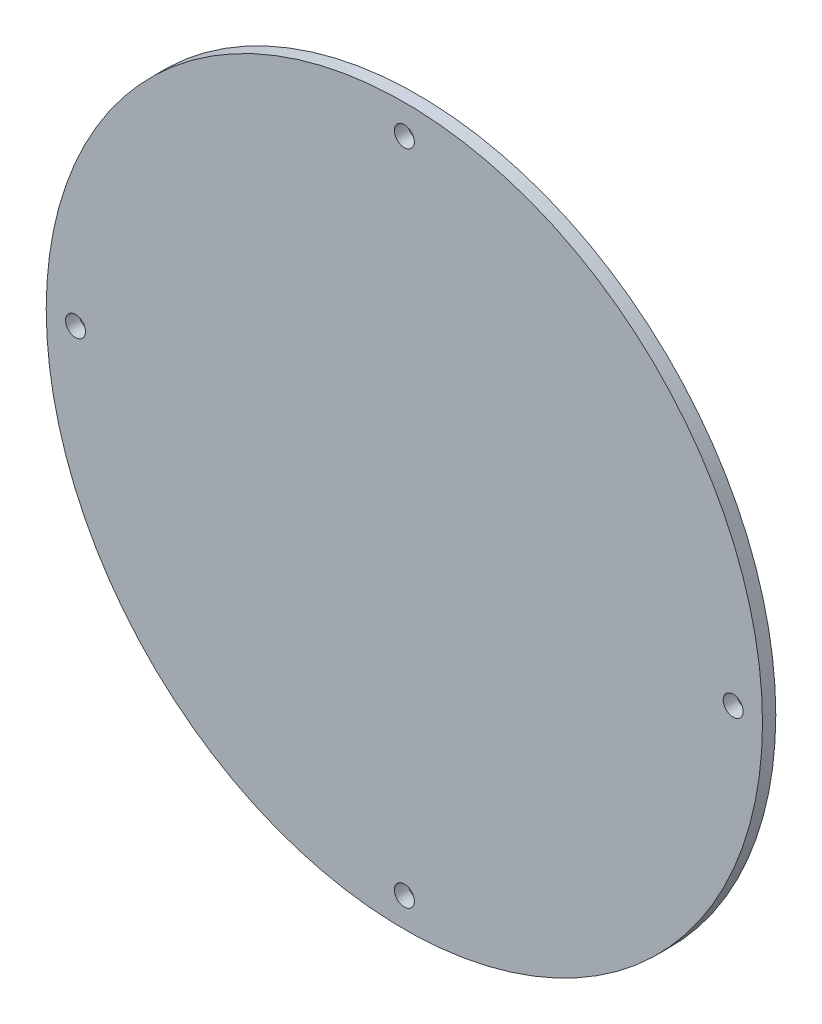
ISO-10303-21;
HEADER;
FILE_DESCRIPTION(('STEP AP214'),'2;1');
FILE_NAME('part.step','',(''),(''),'','','');
FILE_SCHEMA(('AUTOMOTIVE_DESIGN { 1 0 10303 214 1 1 1 1 }'));
ENDSEC;
DATA;
#1=APPLICATION_CONTEXT('core data for automotive mechanical design processes');
#2=APPLICATION_PROTOCOL_DEFINITION('international standard','automotive_design',2000,#1);
#3=PRODUCT_CONTEXT('',#1,'mechanical');
#4=PRODUCT('Part','Part','',(#3));
#5=PRODUCT_RELATED_PRODUCT_CATEGORY('part','',(#4));
#6=PRODUCT_DEFINITION_FORMATION('','',#4);
#7=PRODUCT_DEFINITION_CONTEXT('part definition',#1,'design');
#8=PRODUCT_DEFINITION('design','',#6,#7);
#9=PRODUCT_DEFINITION_SHAPE('','',#8);
#10=(LENGTH_UNIT() NAMED_UNIT(*) SI_UNIT(.MILLI.,.METRE.));
#11=(NAMED_UNIT(*) PLANE_ANGLE_UNIT() SI_UNIT($,.RADIAN.));
#12=(NAMED_UNIT(*) SI_UNIT($,.STERADIAN.) SOLID_ANGLE_UNIT());
#13=UNCERTAINTY_MEASURE_WITH_UNIT(LENGTH_MEASURE(1.E-05),#10,'distance_accuracy_value','');
#14=(GEOMETRIC_REPRESENTATION_CONTEXT(3) GLOBAL_UNCERTAINTY_ASSIGNED_CONTEXT((#13)) GLOBAL_UNIT_ASSIGNED_CONTEXT((#10,
#11,#12)) REPRESENTATION_CONTEXT('',''));
#15=CARTESIAN_POINT('',(0.,0.,0.));
#16=DIRECTION('',(0.,0.,1.));
#17=DIRECTION('',(1.,0.,0.));
#18=AXIS2_PLACEMENT_3D('',#15,#16,#17);
#19=CARTESIAN_POINT('',(0.,78.5,3.175));
#20=DIRECTION('',(0.,0.,-1.));
#21=DIRECTION('',(-1.,0.,0.));
#22=AXIS2_PLACEMENT_3D('',#19,#20,#21);
#23=CYLINDRICAL_SURFACE('',#22,2.38125);
#24=CARTESIAN_POINT('',(0.,78.5,3.175));
#25=DIRECTION('',(0.,0.,1.));
#26=DIRECTION('',(1.,0.,0.));
#27=AXIS2_PLACEMENT_3D('',#24,#25,#26);
#28=CIRCLE('',#27,2.38125);
#29=CARTESIAN_POINT('',(2.38125,78.5,3.175));
#30=VERTEX_POINT('',#29);
#31=EDGE_CURVE('E42',#30,#30,#28,.T.);
#32=ORIENTED_EDGE('',*,*,#31,.T.);
#33=EDGE_LOOP('',(#32));
#34=FACE_BOUND('',#33,.T.);
#35=CARTESIAN_POINT('',(0.,78.5,0.));
#36=DIRECTION('',(0.,0.,1.));
#37=DIRECTION('',(1.,0.,0.));
#38=AXIS2_PLACEMENT_3D('',#35,#36,#37);
#39=CIRCLE('',#38,2.38125);
#40=CARTESIAN_POINT('',(2.38125,78.5,0.));
#41=VERTEX_POINT('',#40);
#42=EDGE_CURVE('E59',#41,#41,#39,.T.);
#43=ORIENTED_EDGE('',*,*,#42,.F.);
#44=EDGE_LOOP('',(#43));
#45=FACE_BOUND('',#44,.T.);
#46=ADVANCED_FACE('F34',(#34,#45),#23,.F.);
#47=CARTESIAN_POINT('',(78.5,0.,3.175));
#48=DIRECTION('',(0.,0.,-1.));
#49=DIRECTION('',(-1.,0.,0.));
#50=AXIS2_PLACEMENT_3D('',#47,#48,#49);
#51=CYLINDRICAL_SURFACE('',#50,2.38125000000001);
#52=CARTESIAN_POINT('',(78.5,0.,3.175));
#53=DIRECTION('',(0.,0.,1.));
#54=DIRECTION('',(1.,0.,0.));
#55=AXIS2_PLACEMENT_3D('',#52,#53,#54);
#56=CIRCLE('',#55,2.38125000000001);
#57=CARTESIAN_POINT('',(80.88125,0.,3.175));
#58=VERTEX_POINT('',#57);
#59=EDGE_CURVE('E47',#58,#58,#56,.T.);
#60=ORIENTED_EDGE('',*,*,#59,.T.);
#61=EDGE_LOOP('',(#60));
#62=FACE_BOUND('',#61,.T.);
#63=CARTESIAN_POINT('',(78.5,0.,0.));
#64=DIRECTION('',(0.,0.,1.));
#65=DIRECTION('',(1.,0.,0.));
#66=AXIS2_PLACEMENT_3D('',#63,#64,#65);
#67=CIRCLE('',#66,2.38125000000001);
#68=CARTESIAN_POINT('',(80.88125,0.,0.));
#69=VERTEX_POINT('',#68);
#70=EDGE_CURVE('E57',#69,#69,#67,.T.);
#71=ORIENTED_EDGE('',*,*,#70,.F.);
#72=EDGE_LOOP('',(#71));
#73=FACE_BOUND('',#72,.T.);
#74=ADVANCED_FACE('F77',(#62,#73),#51,.F.);
#75=CARTESIAN_POINT('',(0.,-78.5,3.175));
#76=DIRECTION('',(0.,0.,-1.));
#77=DIRECTION('',(-1.,0.,0.));
#78=AXIS2_PLACEMENT_3D('',#75,#76,#77);
#79=CYLINDRICAL_SURFACE('',#78,2.38125);
#80=CARTESIAN_POINT('',(0.,-78.5,3.175));
#81=DIRECTION('',(0.,0.,1.));
#82=DIRECTION('',(1.,0.,0.));
#83=AXIS2_PLACEMENT_3D('',#80,#81,#82);
#84=CIRCLE('',#83,2.38125);
#85=CARTESIAN_POINT('',(2.38125000000003,-78.5,3.175));
#86=VERTEX_POINT('',#85);
#87=EDGE_CURVE('E68',#86,#86,#84,.T.);
#88=ORIENTED_EDGE('',*,*,#87,.T.);
#89=EDGE_LOOP('',(#88));
#90=FACE_BOUND('',#89,.T.);
#91=CARTESIAN_POINT('',(0.,-78.5,0.));
#92=DIRECTION('',(0.,0.,1.));
#93=DIRECTION('',(1.,0.,0.));
#94=AXIS2_PLACEMENT_3D('',#91,#92,#93);
#95=CIRCLE('',#94,2.38125);
#96=CARTESIAN_POINT('',(2.38125000000003,-78.5,0.));
#97=VERTEX_POINT('',#96);
#98=EDGE_CURVE('E54',#97,#97,#95,.T.);
#99=ORIENTED_EDGE('',*,*,#98,.F.);
#100=EDGE_LOOP('',(#99));
#101=FACE_BOUND('',#100,.T.);
#102=ADVANCED_FACE('F95',(#90,#101),#79,.F.);
#103=CARTESIAN_POINT('',(-78.5,0.,3.175));
#104=DIRECTION('',(0.,0.,-1.));
#105=DIRECTION('',(-1.,0.,0.));
#106=AXIS2_PLACEMENT_3D('',#103,#104,#105);
#107=CYLINDRICAL_SURFACE('',#106,2.38125000000001);
#108=CARTESIAN_POINT('',(-78.5,0.,3.175));
#109=DIRECTION('',(0.,0.,1.));
#110=DIRECTION('',(1.,0.,0.));
#111=AXIS2_PLACEMENT_3D('',#108,#109,#110);
#112=CIRCLE('',#111,2.38125000000001);
#113=CARTESIAN_POINT('',(-76.11875,0.,3.175));
#114=VERTEX_POINT('',#113);
#115=EDGE_CURVE('E64',#114,#114,#112,.T.);
#116=ORIENTED_EDGE('',*,*,#115,.T.);
#117=EDGE_LOOP('',(#116));
#118=FACE_BOUND('',#117,.T.);
#119=CARTESIAN_POINT('',(-78.5,0.,0.));
#120=DIRECTION('',(0.,0.,1.));
#121=DIRECTION('',(1.,0.,0.));
#122=AXIS2_PLACEMENT_3D('',#119,#120,#121);
#123=CIRCLE('',#122,2.38125000000001);
#124=CARTESIAN_POINT('',(-76.11875,0.,0.));
#125=VERTEX_POINT('',#124);
#126=EDGE_CURVE('E51',#125,#125,#123,.T.);
#127=ORIENTED_EDGE('',*,*,#126,.F.);
#128=EDGE_LOOP('',(#127));
#129=FACE_BOUND('',#128,.T.);
#130=ADVANCED_FACE('F36',(#118,#129),#107,.F.);
#131=CARTESIAN_POINT('',(0.,0.,3.175));
#132=DIRECTION('',(0.,0.,-1.));
#133=DIRECTION('',(-1.,0.,0.));
#134=AXIS2_PLACEMENT_3D('',#131,#132,#133);
#135=CYLINDRICAL_SURFACE('',#134,85.5);
#136=CARTESIAN_POINT('',(0.,0.,3.175));
#137=DIRECTION('',(0.,0.,1.));
#138=DIRECTION('',(1.,0.,0.));
#139=AXIS2_PLACEMENT_3D('',#136,#137,#138);
#140=CIRCLE('',#139,85.5);
#141=CARTESIAN_POINT('',(85.5,0.,3.175));
#142=VERTEX_POINT('',#141);
#143=EDGE_CURVE('E10',#142,#142,#140,.T.);
#144=ORIENTED_EDGE('',*,*,#143,.F.);
#145=EDGE_LOOP('',(#144));
#146=FACE_BOUND('',#145,.T.);
#147=CARTESIAN_POINT('',(0.,0.,0.));
#148=DIRECTION('',(0.,0.,1.));
#149=DIRECTION('',(1.,0.,0.));
#150=AXIS2_PLACEMENT_3D('',#147,#148,#149);
#151=CIRCLE('',#150,85.5);
#152=CARTESIAN_POINT('',(85.5,0.,0.));
#153=VERTEX_POINT('',#152);
#154=EDGE_CURVE('E38',#153,#153,#151,.T.);
#155=ORIENTED_EDGE('',*,*,#154,.T.);
#156=EDGE_LOOP('',(#155));
#157=FACE_BOUND('',#156,.T.);
#158=ADVANCED_FACE('F84',(#146,#157),#135,.T.);
#159=CARTESIAN_POINT('',(0.,0.,3.175));
#160=DIRECTION('',(0.,0.,1.));
#161=DIRECTION('',(1.,0.,0.));
#162=AXIS2_PLACEMENT_3D('',#159,#160,#161);
#163=PLANE('',#162);
#164=ORIENTED_EDGE('',*,*,#115,.F.);
#165=EDGE_LOOP('',(#164));
#166=FACE_BOUND('',#165,.T.);
#167=ORIENTED_EDGE('',*,*,#87,.F.);
#168=EDGE_LOOP('',(#167));
#169=FACE_BOUND('',#168,.T.);
#170=ORIENTED_EDGE('',*,*,#59,.F.);
#171=EDGE_LOOP('',(#170));
#172=FACE_BOUND('',#171,.T.);
#173=ORIENTED_EDGE('',*,*,#31,.F.);
#174=EDGE_LOOP('',(#173));
#175=FACE_BOUND('',#174,.T.);
#176=ORIENTED_EDGE('',*,*,#143,.T.);
#177=EDGE_LOOP('',(#176));
#178=FACE_BOUND('',#177,.T.);
#179=ADVANCED_FACE('F80',(#166,#169,#172,#175,#178),#163,.T.);
#180=CARTESIAN_POINT('',(0.,0.,0.));
#181=DIRECTION('',(0.,0.,1.));
#182=DIRECTION('',(1.,0.,0.));
#183=AXIS2_PLACEMENT_3D('',#180,#181,#182);
#184=PLANE('',#183);
#185=ORIENTED_EDGE('',*,*,#126,.T.);
#186=EDGE_LOOP('',(#185));
#187=FACE_BOUND('',#186,.T.);
#188=ORIENTED_EDGE('',*,*,#98,.T.);
#189=EDGE_LOOP('',(#188));
#190=FACE_BOUND('',#189,.T.);
#191=ORIENTED_EDGE('',*,*,#70,.T.);
#192=EDGE_LOOP('',(#191));
#193=FACE_BOUND('',#192,.T.);
#194=ORIENTED_EDGE('',*,*,#42,.T.);
#195=EDGE_LOOP('',(#194));
#196=FACE_BOUND('',#195,.T.);
#197=ORIENTED_EDGE('',*,*,#154,.F.);
#198=EDGE_LOOP('',(#197));
#199=FACE_BOUND('',#198,.T.);
#200=ADVANCED_FACE('F83',(#187,#190,#193,#196,#199),#184,.F.);
#201=CLOSED_SHELL('',(#46,#74,#102,#130,#158,#179,#200));
#202=MANIFOLD_SOLID_BREP('B2',#201);
#203=ADVANCED_BREP_SHAPE_REPRESENTATION('',(#18,#202),#14);
#204=SHAPE_DEFINITION_REPRESENTATION(#9,#203);
ENDSEC;
END-ISO-10303-21;
